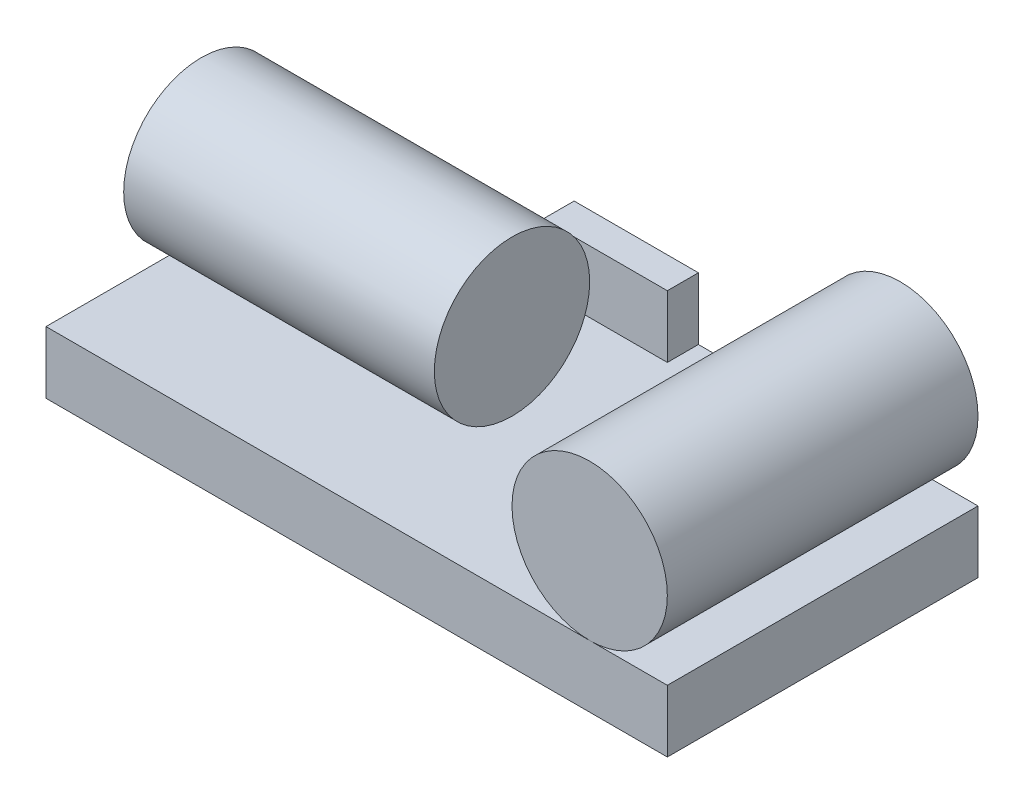
ISO-10303-21;
HEADER;
FILE_DESCRIPTION(('STEP AP214'),'2;1');
FILE_NAME('part.step','',(''),(''),'','','');
FILE_SCHEMA(('AUTOMOTIVE_DESIGN { 1 0 10303 214 1 1 1 1 }'));
ENDSEC;
DATA;
#1=APPLICATION_CONTEXT('core data for automotive mechanical design processes');
#2=APPLICATION_PROTOCOL_DEFINITION('international standard','automotive_design',2000,#1);
#3=PRODUCT_CONTEXT('',#1,'mechanical');
#4=PRODUCT('Part','Part','',(#3));
#5=PRODUCT_RELATED_PRODUCT_CATEGORY('part','',(#4));
#6=PRODUCT_DEFINITION_FORMATION('','',#4);
#7=PRODUCT_DEFINITION_CONTEXT('part definition',#1,'design');
#8=PRODUCT_DEFINITION('design','',#6,#7);
#9=PRODUCT_DEFINITION_SHAPE('','',#8);
#10=(LENGTH_UNIT() NAMED_UNIT(*) SI_UNIT(.MILLI.,.METRE.));
#11=(NAMED_UNIT(*) PLANE_ANGLE_UNIT() SI_UNIT($,.RADIAN.));
#12=(NAMED_UNIT(*) SI_UNIT($,.STERADIAN.) SOLID_ANGLE_UNIT());
#13=UNCERTAINTY_MEASURE_WITH_UNIT(LENGTH_MEASURE(1.E-05),#10,'distance_accuracy_value','');
#14=(GEOMETRIC_REPRESENTATION_CONTEXT(3) GLOBAL_UNCERTAINTY_ASSIGNED_CONTEXT((#13)) GLOBAL_UNIT_ASSIGNED_CONTEXT((#10,
#11,#12)) REPRESENTATION_CONTEXT('',''));
#15=CARTESIAN_POINT('',(0.,0.,0.));
#16=DIRECTION('',(0.,0.,1.));
#17=DIRECTION('',(1.,0.,0.));
#18=AXIS2_PLACEMENT_3D('',#15,#16,#17);
#19=CARTESIAN_POINT('',(10.,4.5,-5.));
#20=DIRECTION('',(-1.,0.,0.));
#21=DIRECTION('',(0.,0.,1.));
#22=AXIS2_PLACEMENT_3D('',#19,#20,#21);
#23=CYLINDRICAL_SURFACE('',#22,2.5);
#24=CARTESIAN_POINT('',(10.,4.5,-5.));
#25=DIRECTION('',(-1.,0.,0.));
#26=DIRECTION('',(0.,0.,1.));
#27=AXIS2_PLACEMENT_3D('',#24,#25,#26);
#28=CIRCLE('',#27,2.5);
#29=CARTESIAN_POINT('',(10.,4.5,-2.5));
#30=VERTEX_POINT('',#29);
#31=EDGE_CURVE('E11',#30,#30,#28,.T.);
#32=ORIENTED_EDGE('',*,*,#31,.T.);
#33=EDGE_LOOP('',(#32));
#34=FACE_BOUND('',#33,.T.);
#35=CARTESIAN_POINT('',(0.,4.5,-5.));
#36=DIRECTION('',(-1.,0.,0.));
#37=DIRECTION('',(0.,0.,1.));
#38=AXIS2_PLACEMENT_3D('',#35,#36,#37);
#39=CIRCLE('',#38,2.5);
#40=CARTESIAN_POINT('',(0.,4.5,-2.5));
#41=VERTEX_POINT('',#40);
#42=EDGE_CURVE('E55',#41,#41,#39,.T.);
#43=ORIENTED_EDGE('',*,*,#42,.F.);
#44=EDGE_LOOP('',(#43));
#45=FACE_BOUND('',#44,.T.);
#46=ADVANCED_FACE('F52',(#34,#45),#23,.T.);
#47=CARTESIAN_POINT('',(10.,4.5,-5.));
#48=DIRECTION('',(-1.,0.,0.));
#49=DIRECTION('',(0.,0.,1.));
#50=AXIS2_PLACEMENT_3D('',#47,#48,#49);
#51=PLANE('',#50);
#52=ORIENTED_EDGE('',*,*,#31,.F.);
#53=EDGE_LOOP('',(#52));
#54=FACE_BOUND('',#53,.T.);
#55=ADVANCED_FACE('F67',(#54),#51,.F.);
#56=CARTESIAN_POINT('',(0.,4.5,-5.));
#57=DIRECTION('',(-1.,0.,0.));
#58=DIRECTION('',(0.,0.,1.));
#59=AXIS2_PLACEMENT_3D('',#56,#57,#58);
#60=PLANE('',#59);
#61=ORIENTED_EDGE('',*,*,#42,.T.);
#62=EDGE_LOOP('',(#61));
#63=FACE_BOUND('',#62,.T.);
#64=ADVANCED_FACE('F64',(#63),#60,.T.);
#65=CLOSED_SHELL('',(#46,#55,#64));
#66=MANIFOLD_SOLID_BREP('B2',#65);
#67=CARTESIAN_POINT('',(17.5,4.5,-17.0710678118655));
#68=DIRECTION('',(0.,0.,1.));
#69=DIRECTION('',(1.,0.,0.));
#70=AXIS2_PLACEMENT_3D('',#67,#68,#69);
#71=CYLINDRICAL_SURFACE('',#70,2.5);
#72=CARTESIAN_POINT('',(17.5,4.5,-10.));
#73=DIRECTION('',(0.,0.,1.));
#74=DIRECTION('',(1.,0.,0.));
#75=AXIS2_PLACEMENT_3D('',#72,#73,#74);
#76=CIRCLE('',#75,2.5);
#77=CARTESIAN_POINT('',(20.,4.5,-10.));
#78=VERTEX_POINT('',#77);
#79=EDGE_CURVE('E51',#78,#78,#76,.F.);
#80=ORIENTED_EDGE('',*,*,#79,.F.);
#81=EDGE_LOOP('',(#80));
#82=FACE_BOUND('',#81,.T.);
#83=CARTESIAN_POINT('',(17.5,4.5,0.));
#84=DIRECTION('',(0.,0.,1.));
#85=DIRECTION('',(1.,0.,0.));
#86=AXIS2_PLACEMENT_3D('',#83,#84,#85);
#87=CIRCLE('',#86,2.5);
#88=CARTESIAN_POINT('',(20.,4.5,0.));
#89=VERTEX_POINT('',#88);
#90=EDGE_CURVE('E108',#89,#89,#87,.T.);
#91=ORIENTED_EDGE('',*,*,#90,.F.);
#92=EDGE_LOOP('',(#91));
#93=FACE_BOUND('',#92,.T.);
#94=ADVANCED_FACE('F102',(#82,#93),#71,.T.);
#95=CARTESIAN_POINT('',(17.5,4.5,0.));
#96=DIRECTION('',(0.,0.,1.));
#97=DIRECTION('',(1.,0.,0.));
#98=AXIS2_PLACEMENT_3D('',#95,#96,#97);
#99=PLANE('',#98);
#100=ORIENTED_EDGE('',*,*,#90,.T.);
#101=EDGE_LOOP('',(#100));
#102=FACE_BOUND('',#101,.T.);
#103=ADVANCED_FACE('F114',(#102),#99,.T.);
#104=CARTESIAN_POINT('',(0.,2.,-10.));
#105=DIRECTION('',(0.,0.,1.));
#106=DIRECTION('',(1.,0.,0.));
#107=AXIS2_PLACEMENT_3D('',#104,#105,#106);
#108=PLANE('',#107);
#109=ORIENTED_EDGE('',*,*,#79,.T.);
#110=EDGE_LOOP('',(#109));
#111=FACE_BOUND('',#110,.T.);
#112=ADVANCED_FACE('F121',(#111),#108,.F.);
#113=CLOSED_SHELL('',(#94,#103,#112));
#114=MANIFOLD_SOLID_BREP('B6',#113);
#115=CARTESIAN_POINT('',(0.,2.,0.));
#116=DIRECTION('',(0.,-1.,0.));
#117=DIRECTION('',(0.,0.,-1.));
#118=AXIS2_PLACEMENT_3D('',#115,#116,#117);
#119=PLANE('',#118);
#120=DIRECTION('',(0.,0.,1.));
#121=VECTOR('',#120,1.);
#122=CARTESIAN_POINT('',(7.,2.,-10.));
#123=LINE('',#122,#121);
#124=CARTESIAN_POINT('',(7.,2.,-10.));
#125=VERTEX_POINT('',#124);
#126=CARTESIAN_POINT('',(7.,2.,-9.));
#127=VERTEX_POINT('',#126);
#128=EDGE_CURVE('E164',#125,#127,#123,.T.);
#129=ORIENTED_EDGE('',*,*,#128,.F.);
#130=DIRECTION('',(-1.,0.,0.));
#131=VECTOR('',#130,1.);
#132=CARTESIAN_POINT('',(0.,2.,-10.));
#133=LINE('',#132,#131);
#134=CARTESIAN_POINT('',(0.,2.,-10.));
#135=VERTEX_POINT('',#134);
#136=EDGE_CURVE('E254',#125,#135,#133,.T.);
#137=ORIENTED_EDGE('',*,*,#136,.T.);
#138=DIRECTION('',(0.,0.,1.));
#139=VECTOR('',#138,1.);
#140=CARTESIAN_POINT('',(0.,2.,0.));
#141=LINE('',#140,#139);
#142=CARTESIAN_POINT('',(0.,2.,0.));
#143=VERTEX_POINT('',#142);
#144=EDGE_CURVE('E243',#135,#143,#141,.T.);
#145=ORIENTED_EDGE('',*,*,#144,.T.);
#146=DIRECTION('',(1.,0.,0.));
#147=VECTOR('',#146,1.);
#148=CARTESIAN_POINT('',(0.,2.,0.));
#149=LINE('',#148,#147);
#150=CARTESIAN_POINT('',(20.,2.,0.));
#151=VERTEX_POINT('',#150);
#152=EDGE_CURVE('E247',#143,#151,#149,.T.);
#153=ORIENTED_EDGE('',*,*,#152,.T.);
#154=DIRECTION('',(0.,0.,-1.));
#155=VECTOR('',#154,1.);
#156=CARTESIAN_POINT('',(20.,2.,0.));
#157=LINE('',#156,#155);
#158=CARTESIAN_POINT('',(20.,2.,-10.));
#159=VERTEX_POINT('',#158);
#160=EDGE_CURVE('E251',#151,#159,#157,.T.);
#161=ORIENTED_EDGE('',*,*,#160,.T.);
#162=CARTESIAN_POINT('',(11.,2.,-10.));
#163=VERTEX_POINT('',#162);
#164=EDGE_CURVE('E255',#159,#163,#133,.T.);
#165=ORIENTED_EDGE('',*,*,#164,.T.);
#166=DIRECTION('',(0.,0.,-1.));
#167=VECTOR('',#166,1.);
#168=CARTESIAN_POINT('',(11.,2.,-10.));
#169=LINE('',#168,#167);
#170=CARTESIAN_POINT('',(11.,2.,-9.));
#171=VERTEX_POINT('',#170);
#172=EDGE_CURVE('E228',#171,#163,#169,.T.);
#173=ORIENTED_EDGE('',*,*,#172,.F.);
#174=DIRECTION('',(1.,0.,0.));
#175=VECTOR('',#174,1.);
#176=CARTESIAN_POINT('',(7.,2.,-9.));
#177=LINE('',#176,#175);
#178=EDGE_CURVE('E159',#127,#171,#177,.T.);
#179=ORIENTED_EDGE('',*,*,#178,.F.);
#180=EDGE_LOOP('',(#129,#137,#145,#153,#161,#165,#173,#179));
#181=FACE_BOUND('',#180,.T.);
#182=ADVANCED_FACE('F143',(#181),#119,.F.);
#183=CARTESIAN_POINT('',(0.,2.,0.));
#184=DIRECTION('',(1.,0.,0.));
#185=DIRECTION('',(0.,0.,-1.));
#186=AXIS2_PLACEMENT_3D('',#183,#184,#185);
#187=PLANE('',#186);
#188=DIRECTION('',(0.,0.,1.));
#189=VECTOR('',#188,1.);
#190=CARTESIAN_POINT('',(0.,0.,0.));
#191=LINE('',#190,#189);
#192=CARTESIAN_POINT('',(0.,0.,-10.));
#193=VERTEX_POINT('',#192);
#194=CARTESIAN_POINT('',(0.,0.,0.));
#195=VERTEX_POINT('',#194);
#196=EDGE_CURVE('E232',#193,#195,#191,.T.);
#197=ORIENTED_EDGE('',*,*,#196,.T.);
#198=DIRECTION('',(0.,-1.,0.));
#199=VECTOR('',#198,1.);
#200=CARTESIAN_POINT('',(0.,2.,0.));
#201=LINE('',#200,#199);
#202=EDGE_CURVE('E100',#143,#195,#201,.T.);
#203=ORIENTED_EDGE('',*,*,#202,.F.);
#204=ORIENTED_EDGE('',*,*,#144,.F.);
#205=DIRECTION('',(0.,-1.,0.));
#206=VECTOR('',#205,1.);
#207=CARTESIAN_POINT('',(0.,2.,-10.));
#208=LINE('',#207,#206);
#209=EDGE_CURVE('E257',#135,#193,#208,.T.);
#210=ORIENTED_EDGE('',*,*,#209,.T.);
#211=EDGE_LOOP('',(#197,#203,#204,#210));
#212=FACE_BOUND('',#211,.T.);
#213=ADVANCED_FACE('F145',(#212),#187,.F.);
#214=CARTESIAN_POINT('',(0.,2.,0.));
#215=DIRECTION('',(0.,0.,-1.));
#216=DIRECTION('',(-1.,0.,0.));
#217=AXIS2_PLACEMENT_3D('',#214,#215,#216);
#218=PLANE('',#217);
#219=DIRECTION('',(1.,0.,0.));
#220=VECTOR('',#219,1.);
#221=CARTESIAN_POINT('',(0.,0.,0.));
#222=LINE('',#221,#220);
#223=CARTESIAN_POINT('',(20.,0.,0.));
#224=VERTEX_POINT('',#223);
#225=EDGE_CURVE('E237',#195,#224,#222,.T.);
#226=ORIENTED_EDGE('',*,*,#225,.T.);
#227=DIRECTION('',(0.,-1.,0.));
#228=VECTOR('',#227,1.);
#229=CARTESIAN_POINT('',(20.,2.,0.));
#230=LINE('',#229,#228);
#231=EDGE_CURVE('E152',#151,#224,#230,.T.);
#232=ORIENTED_EDGE('',*,*,#231,.F.);
#233=ORIENTED_EDGE('',*,*,#152,.F.);
#234=ORIENTED_EDGE('',*,*,#202,.T.);
#235=EDGE_LOOP('',(#226,#232,#233,#234));
#236=FACE_BOUND('',#235,.T.);
#237=ADVANCED_FACE('F327',(#236),#218,.F.);
#238=CARTESIAN_POINT('',(20.,2.,0.));
#239=DIRECTION('',(-1.,0.,0.));
#240=DIRECTION('',(0.,0.,1.));
#241=AXIS2_PLACEMENT_3D('',#238,#239,#240);
#242=PLANE('',#241);
#243=DIRECTION('',(0.,0.,-1.));
#244=VECTOR('',#243,1.);
#245=CARTESIAN_POINT('',(20.,0.,0.));
#246=LINE('',#245,#244);
#247=CARTESIAN_POINT('',(20.,0.,-10.));
#248=VERTEX_POINT('',#247);
#249=EDGE_CURVE('E261',#224,#248,#246,.T.);
#250=ORIENTED_EDGE('',*,*,#249,.T.);
#251=DIRECTION('',(0.,-1.,0.));
#252=VECTOR('',#251,1.);
#253=CARTESIAN_POINT('',(20.,2.,-10.));
#254=LINE('',#253,#252);
#255=EDGE_CURVE('E269',#159,#248,#254,.T.);
#256=ORIENTED_EDGE('',*,*,#255,.F.);
#257=ORIENTED_EDGE('',*,*,#160,.F.);
#258=ORIENTED_EDGE('',*,*,#231,.T.);
#259=EDGE_LOOP('',(#250,#256,#257,#258));
#260=FACE_BOUND('',#259,.T.);
#261=ADVANCED_FACE('F278',(#260),#242,.F.);
#262=CARTESIAN_POINT('',(0.,2.,-10.));
#263=DIRECTION('',(0.,0.,1.));
#264=DIRECTION('',(1.,0.,0.));
#265=AXIS2_PLACEMENT_3D('',#262,#263,#264);
#266=PLANE('',#265);
#267=DIRECTION('',(-1.,0.,0.));
#268=VECTOR('',#267,1.);
#269=CARTESIAN_POINT('',(0.,0.,-10.));
#270=LINE('',#269,#268);
#271=EDGE_CURVE('E248',#248,#193,#270,.T.);
#272=ORIENTED_EDGE('',*,*,#271,.T.);
#273=ORIENTED_EDGE('',*,*,#209,.F.);
#274=ORIENTED_EDGE('',*,*,#136,.F.);
#275=DIRECTION('',(0.,-1.,0.));
#276=VECTOR('',#275,1.);
#277=CARTESIAN_POINT('',(7.,4.,-10.));
#278=LINE('',#277,#276);
#279=CARTESIAN_POINT('',(7.,4.,-10.));
#280=VERTEX_POINT('',#279);
#281=EDGE_CURVE('E293',#280,#125,#278,.T.);
#282=ORIENTED_EDGE('',*,*,#281,.F.);
#283=DIRECTION('',(-1.,0.,0.));
#284=VECTOR('',#283,1.);
#285=CARTESIAN_POINT('',(7.,4.,-10.));
#286=LINE('',#285,#284);
#287=CARTESIAN_POINT('',(11.,4.,-10.));
#288=VERTEX_POINT('',#287);
#289=EDGE_CURVE('E223',#288,#280,#286,.T.);
#290=ORIENTED_EDGE('',*,*,#289,.F.);
#291=DIRECTION('',(0.,-1.,0.));
#292=VECTOR('',#291,1.);
#293=CARTESIAN_POINT('',(11.,4.,-10.));
#294=LINE('',#293,#292);
#295=EDGE_CURVE('E239',#288,#163,#294,.T.);
#296=ORIENTED_EDGE('',*,*,#295,.T.);
#297=ORIENTED_EDGE('',*,*,#164,.F.);
#298=ORIENTED_EDGE('',*,*,#255,.T.);
#299=EDGE_LOOP('',(#272,#273,#274,#282,#290,#296,#297,#298));
#300=FACE_BOUND('',#299,.T.);
#301=ADVANCED_FACE('F287',(#300),#266,.F.);
#302=CARTESIAN_POINT('',(0.,0.,0.));
#303=DIRECTION('',(0.,-1.,0.));
#304=DIRECTION('',(0.,0.,-1.));
#305=AXIS2_PLACEMENT_3D('',#302,#303,#304);
#306=PLANE('',#305);
#307=ORIENTED_EDGE('',*,*,#196,.F.);
#308=ORIENTED_EDGE('',*,*,#271,.F.);
#309=ORIENTED_EDGE('',*,*,#249,.F.);
#310=ORIENTED_EDGE('',*,*,#225,.F.);
#311=EDGE_LOOP('',(#307,#308,#309,#310));
#312=FACE_BOUND('',#311,.T.);
#313=ADVANCED_FACE('F284',(#312),#306,.T.);
#314=CARTESIAN_POINT('',(7.,4.,-10.));
#315=DIRECTION('',(1.,0.,0.));
#316=DIRECTION('',(0.,0.,-1.));
#317=AXIS2_PLACEMENT_3D('',#314,#315,#316);
#318=PLANE('',#317);
#319=ORIENTED_EDGE('',*,*,#128,.T.);
#320=DIRECTION('',(0.,-1.,0.));
#321=VECTOR('',#320,1.);
#322=CARTESIAN_POINT('',(7.,4.,-9.));
#323=LINE('',#322,#321);
#324=CARTESIAN_POINT('',(7.,4.,-9.));
#325=VERTEX_POINT('',#324);
#326=EDGE_CURVE('E211',#325,#127,#323,.T.);
#327=ORIENTED_EDGE('',*,*,#326,.F.);
#328=DIRECTION('',(0.,0.,1.));
#329=VECTOR('',#328,1.);
#330=CARTESIAN_POINT('',(7.,4.,-10.));
#331=LINE('',#330,#329);
#332=EDGE_CURVE('E218',#280,#325,#331,.T.);
#333=ORIENTED_EDGE('',*,*,#332,.F.);
#334=ORIENTED_EDGE('',*,*,#281,.T.);
#335=EDGE_LOOP('',(#319,#327,#333,#334));
#336=FACE_BOUND('',#335,.T.);
#337=ADVANCED_FACE('F230',(#336),#318,.F.);
#338=CARTESIAN_POINT('',(7.,4.,-9.));
#339=DIRECTION('',(0.,0.,-1.));
#340=DIRECTION('',(-1.,0.,0.));
#341=AXIS2_PLACEMENT_3D('',#338,#339,#340);
#342=PLANE('',#341);
#343=ORIENTED_EDGE('',*,*,#178,.T.);
#344=DIRECTION('',(0.,-1.,0.));
#345=VECTOR('',#344,1.);
#346=CARTESIAN_POINT('',(11.,4.,-9.));
#347=LINE('',#346,#345);
#348=CARTESIAN_POINT('',(11.,4.,-9.));
#349=VERTEX_POINT('',#348);
#350=EDGE_CURVE('E213',#349,#171,#347,.T.);
#351=ORIENTED_EDGE('',*,*,#350,.F.);
#352=DIRECTION('',(1.,0.,0.));
#353=VECTOR('',#352,1.);
#354=CARTESIAN_POINT('',(7.,4.,-9.));
#355=LINE('',#354,#353);
#356=EDGE_CURVE('E207',#325,#349,#355,.T.);
#357=ORIENTED_EDGE('',*,*,#356,.F.);
#358=ORIENTED_EDGE('',*,*,#326,.T.);
#359=EDGE_LOOP('',(#343,#351,#357,#358));
#360=FACE_BOUND('',#359,.T.);
#361=ADVANCED_FACE('F209',(#360),#342,.F.);
#362=CARTESIAN_POINT('',(11.,4.,-10.));
#363=DIRECTION('',(-1.,0.,0.));
#364=DIRECTION('',(0.,0.,1.));
#365=AXIS2_PLACEMENT_3D('',#362,#363,#364);
#366=PLANE('',#365);
#367=ORIENTED_EDGE('',*,*,#172,.T.);
#368=ORIENTED_EDGE('',*,*,#295,.F.);
#369=DIRECTION('',(0.,0.,-1.));
#370=VECTOR('',#369,1.);
#371=CARTESIAN_POINT('',(11.,4.,-10.));
#372=LINE('',#371,#370);
#373=EDGE_CURVE('E217',#349,#288,#372,.T.);
#374=ORIENTED_EDGE('',*,*,#373,.F.);
#375=ORIENTED_EDGE('',*,*,#350,.T.);
#376=EDGE_LOOP('',(#367,#368,#374,#375));
#377=FACE_BOUND('',#376,.T.);
#378=ADVANCED_FACE('F311',(#377),#366,.F.);
#379=CARTESIAN_POINT('',(0.,4.,0.));
#380=DIRECTION('',(0.,1.,0.));
#381=DIRECTION('',(0.,0.,1.));
#382=AXIS2_PLACEMENT_3D('',#379,#380,#381);
#383=PLANE('',#382);
#384=ORIENTED_EDGE('',*,*,#332,.T.);
#385=ORIENTED_EDGE('',*,*,#356,.T.);
#386=ORIENTED_EDGE('',*,*,#373,.T.);
#387=ORIENTED_EDGE('',*,*,#289,.T.);
#388=EDGE_LOOP('',(#384,#385,#386,#387));
#389=FACE_BOUND('',#388,.T.);
#390=ADVANCED_FACE('F221',(#389),#383,.T.);
#391=CLOSED_SHELL('',(#182,#213,#237,#261,#301,#313,#337,#361,#378,#390));
#392=MANIFOLD_SOLID_BREP('B46',#391);
#393=ADVANCED_BREP_SHAPE_REPRESENTATION('',(#18,#66,#114,#392),#14);
#394=SHAPE_DEFINITION_REPRESENTATION(#9,#393);
ENDSEC;
END-ISO-10303-21;
